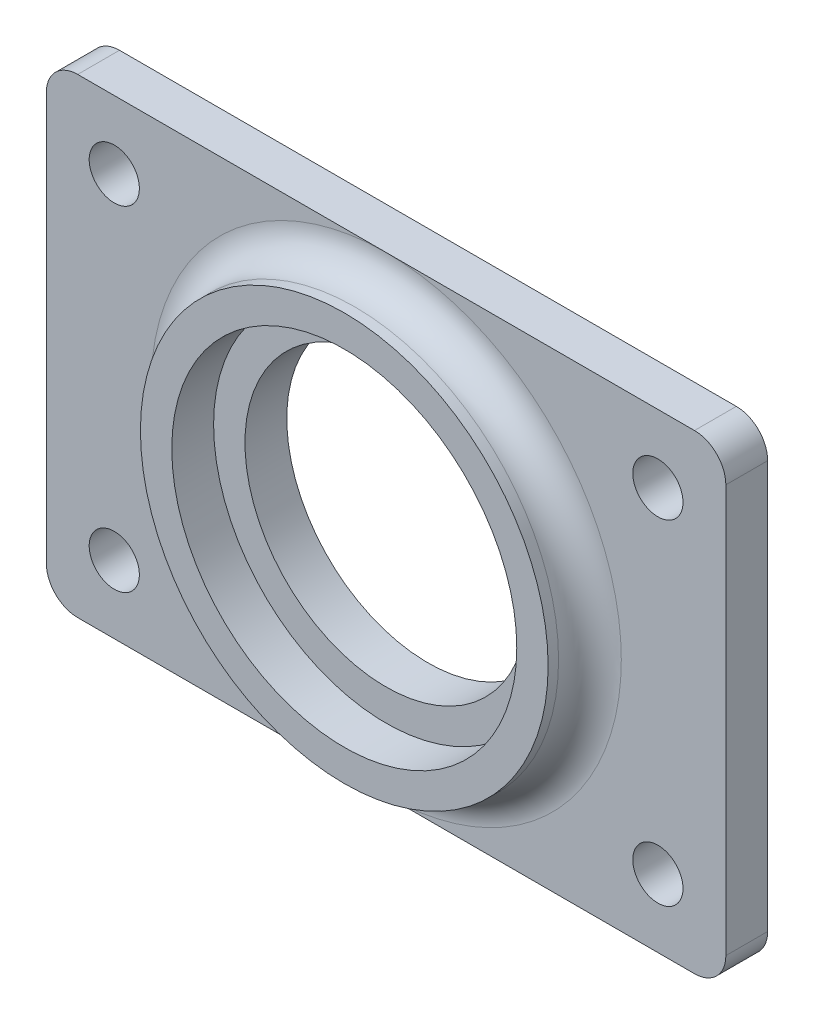
ISO-10303-21;
HEADER;
FILE_DESCRIPTION(('STEP AP214'),'2;1');
FILE_NAME('part.step','',(''),(''),'','','');
FILE_SCHEMA(('AUTOMOTIVE_DESIGN { 1 0 10303 214 1 1 1 1 }'));
ENDSEC;
DATA;
#1=APPLICATION_CONTEXT('core data for automotive mechanical design processes');
#2=APPLICATION_PROTOCOL_DEFINITION('international standard','automotive_design',2000,#1);
#3=PRODUCT_CONTEXT('',#1,'mechanical');
#4=PRODUCT('Part','Part','',(#3));
#5=PRODUCT_RELATED_PRODUCT_CATEGORY('part','',(#4));
#6=PRODUCT_DEFINITION_FORMATION('','',#4);
#7=PRODUCT_DEFINITION_CONTEXT('part definition',#1,'design');
#8=PRODUCT_DEFINITION('design','',#6,#7);
#9=PRODUCT_DEFINITION_SHAPE('','',#8);
#10=(LENGTH_UNIT() NAMED_UNIT(*) SI_UNIT(.MILLI.,.METRE.));
#11=(NAMED_UNIT(*) PLANE_ANGLE_UNIT() SI_UNIT($,.RADIAN.));
#12=(NAMED_UNIT(*) SI_UNIT($,.STERADIAN.) SOLID_ANGLE_UNIT());
#13=UNCERTAINTY_MEASURE_WITH_UNIT(LENGTH_MEASURE(1.E-05),#10,'distance_accuracy_value','');
#14=(GEOMETRIC_REPRESENTATION_CONTEXT(3) GLOBAL_UNCERTAINTY_ASSIGNED_CONTEXT((#13)) GLOBAL_UNIT_ASSIGNED_CONTEXT((#10,
#11,#12)) REPRESENTATION_CONTEXT('',''));
#15=CARTESIAN_POINT('',(0.,0.,0.));
#16=DIRECTION('',(0.,0.,1.));
#17=DIRECTION('',(1.,0.,0.));
#18=AXIS2_PLACEMENT_3D('',#15,#16,#17);
#19=CARTESIAN_POINT('',(0.,0.,4.));
#20=DIRECTION('',(0.,0.,1.));
#21=DIRECTION('',(1.,0.,0.));
#22=AXIS2_PLACEMENT_3D('',#19,#20,#21);
#23=PLANE('',#22);
#24=CARTESIAN_POINT('',(-26.,16.,4.));
#25=DIRECTION('',(0.,0.,1.));
#26=DIRECTION('',(1.,0.,0.));
#27=AXIS2_PLACEMENT_3D('',#24,#25,#26);
#28=CIRCLE('',#27,2.4);
#29=CARTESIAN_POINT('',(-23.6,16.,4.));
#30=VERTEX_POINT('',#29);
#31=EDGE_CURVE('E220',#30,#30,#28,.T.);
#32=ORIENTED_EDGE('',*,*,#31,.F.);
#33=EDGE_LOOP('',(#32));
#34=FACE_BOUND('',#33,.T.);
#35=CARTESIAN_POINT('',(-26.,-16.,4.));
#36=DIRECTION('',(0.,0.,1.));
#37=DIRECTION('',(1.,0.,0.));
#38=AXIS2_PLACEMENT_3D('',#35,#36,#37);
#39=CIRCLE('',#38,2.4);
#40=CARTESIAN_POINT('',(-23.6,-16.,4.));
#41=VERTEX_POINT('',#40);
#42=EDGE_CURVE('E226',#41,#41,#39,.T.);
#43=ORIENTED_EDGE('',*,*,#42,.F.);
#44=EDGE_LOOP('',(#43));
#45=FACE_BOUND('',#44,.T.);
#46=DIRECTION('',(0.,-1.,0.));
#47=VECTOR('',#46,1.);
#48=CARTESIAN_POINT('',(-32.5,0.,4.));
#49=LINE('',#48,#47);
#50=CARTESIAN_POINT('',(-32.5,19.5,4.));
#51=VERTEX_POINT('',#50);
#52=CARTESIAN_POINT('',(-32.5,-19.5,4.));
#53=VERTEX_POINT('',#52);
#54=EDGE_CURVE('E201',#51,#53,#49,.T.);
#55=ORIENTED_EDGE('',*,*,#54,.T.);
#56=CARTESIAN_POINT('',(-29.5,-19.5,4.));
#57=DIRECTION('',(0.,0.,1.));
#58=DIRECTION('',(1.,0.,0.));
#59=AXIS2_PLACEMENT_3D('',#56,#57,#58);
#60=CIRCLE('',#59,3.);
#61=CARTESIAN_POINT('',(-29.5,-22.5,4.));
#62=VERTEX_POINT('',#61);
#63=EDGE_CURVE('E170',#53,#62,#60,.T.);
#64=ORIENTED_EDGE('',*,*,#63,.T.);
#65=DIRECTION('',(1.,0.,0.));
#66=VECTOR('',#65,1.);
#67=CARTESIAN_POINT('',(0.,-22.5,4.));
#68=LINE('',#67,#66);
#69=CARTESIAN_POINT('',(0.,-22.5,4.));
#70=VERTEX_POINT('',#69);
#71=EDGE_CURVE('E135',#62,#70,#68,.T.);
#72=ORIENTED_EDGE('',*,*,#71,.T.);
#73=CARTESIAN_POINT('',(0.,0.,4.));
#74=DIRECTION('',(0.,0.,1.));
#75=DIRECTION('',(1.,0.,0.));
#76=AXIS2_PLACEMENT_3D('',#73,#74,#75);
#77=CIRCLE('',#76,22.5);
#78=CARTESIAN_POINT('',(0.,22.5,4.));
#79=VERTEX_POINT('',#78);
#80=EDGE_CURVE('E166',#70,#79,#77,.F.);
#81=ORIENTED_EDGE('',*,*,#80,.T.);
#82=DIRECTION('',(1.,0.,0.));
#83=VECTOR('',#82,1.);
#84=CARTESIAN_POINT('',(0.,22.5,4.));
#85=LINE('',#84,#83);
#86=CARTESIAN_POINT('',(-29.5,22.5,4.));
#87=VERTEX_POINT('',#86);
#88=EDGE_CURVE('E204',#87,#79,#85,.T.);
#89=ORIENTED_EDGE('',*,*,#88,.F.);
#90=CARTESIAN_POINT('',(-29.5,19.5,4.));
#91=DIRECTION('',(0.,0.,1.));
#92=DIRECTION('',(1.,0.,0.));
#93=AXIS2_PLACEMENT_3D('',#90,#91,#92);
#94=CIRCLE('',#93,3.);
#95=EDGE_CURVE('E168',#87,#51,#94,.T.);
#96=ORIENTED_EDGE('',*,*,#95,.T.);
#97=EDGE_LOOP('',(#55,#64,#72,#81,#89,#96));
#98=FACE_BOUND('',#97,.T.);
#99=ADVANCED_FACE('F41',(#34,#45,#98),#23,.T.);
#100=CARTESIAN_POINT('',(32.5,0.,4.));
#101=DIRECTION('',(1.,0.,0.));
#102=DIRECTION('',(0.,0.,-1.));
#103=AXIS2_PLACEMENT_3D('',#100,#101,#102);
#104=PLANE('',#103);
#105=DIRECTION('',(0.,-1.,0.));
#106=VECTOR('',#105,1.);
#107=CARTESIAN_POINT('',(32.5,0.,4.));
#108=LINE('',#107,#106);
#109=CARTESIAN_POINT('',(32.5,19.5,4.));
#110=VERTEX_POINT('',#109);
#111=CARTESIAN_POINT('',(32.5,-19.5,4.));
#112=VERTEX_POINT('',#111);
#113=EDGE_CURVE('E142',#110,#112,#108,.T.);
#114=ORIENTED_EDGE('',*,*,#113,.T.);
#115=DIRECTION('',(0.,0.,-1.));
#116=VECTOR('',#115,1.);
#117=CARTESIAN_POINT('',(32.5,-19.5,0.));
#118=LINE('',#117,#116);
#119=CARTESIAN_POINT('',(32.5,-19.5,0.));
#120=VERTEX_POINT('',#119);
#121=EDGE_CURVE('E11',#112,#120,#118,.T.);
#122=ORIENTED_EDGE('',*,*,#121,.T.);
#123=DIRECTION('',(0.,-1.,0.));
#124=VECTOR('',#123,1.);
#125=CARTESIAN_POINT('',(32.5,0.,0.));
#126=LINE('',#125,#124);
#127=CARTESIAN_POINT('',(32.5,19.5,0.));
#128=VERTEX_POINT('',#127);
#129=EDGE_CURVE('E184',#128,#120,#126,.T.);
#130=ORIENTED_EDGE('',*,*,#129,.F.);
#131=DIRECTION('',(0.,0.,-1.));
#132=VECTOR('',#131,1.);
#133=CARTESIAN_POINT('',(32.5,19.5,4.));
#134=LINE('',#133,#132);
#135=EDGE_CURVE('E49',#128,#110,#134,.F.);
#136=ORIENTED_EDGE('',*,*,#135,.T.);
#137=EDGE_LOOP('',(#114,#122,#130,#136));
#138=FACE_BOUND('',#137,.T.);
#139=ADVANCED_FACE('F182',(#138),#104,.T.);
#140=CARTESIAN_POINT('',(0.,22.5,4.));
#141=DIRECTION('',(0.,1.,0.));
#142=DIRECTION('',(0.,0.,1.));
#143=AXIS2_PLACEMENT_3D('',#140,#141,#142);
#144=PLANE('',#143);
#145=DIRECTION('',(1.,0.,0.));
#146=VECTOR('',#145,1.);
#147=CARTESIAN_POINT('',(0.,22.5,0.));
#148=LINE('',#147,#146);
#149=CARTESIAN_POINT('',(-29.5,22.5,0.));
#150=VERTEX_POINT('',#149);
#151=CARTESIAN_POINT('',(29.5,22.5,0.));
#152=VERTEX_POINT('',#151);
#153=EDGE_CURVE('E148',#150,#152,#148,.T.);
#154=ORIENTED_EDGE('',*,*,#153,.F.);
#155=DIRECTION('',(0.,0.,-1.));
#156=VECTOR('',#155,1.);
#157=CARTESIAN_POINT('',(-29.5,22.5,4.));
#158=LINE('',#157,#156);
#159=EDGE_CURVE('E175',#150,#87,#158,.F.);
#160=ORIENTED_EDGE('',*,*,#159,.T.);
#161=ORIENTED_EDGE('',*,*,#88,.T.);
#162=CARTESIAN_POINT('',(29.5,22.5,4.));
#163=VERTEX_POINT('',#162);
#164=EDGE_CURVE('E146',#79,#163,#85,.T.);
#165=ORIENTED_EDGE('',*,*,#164,.T.);
#166=DIRECTION('',(0.,0.,-1.));
#167=VECTOR('',#166,1.);
#168=CARTESIAN_POINT('',(29.5,22.5,4.));
#169=LINE('',#168,#167);
#170=EDGE_CURVE('E172',#163,#152,#169,.T.);
#171=ORIENTED_EDGE('',*,*,#170,.T.);
#172=EDGE_LOOP('',(#154,#160,#161,#165,#171));
#173=FACE_BOUND('',#172,.T.);
#174=ADVANCED_FACE('F193',(#173),#144,.T.);
#175=CARTESIAN_POINT('',(-32.5,0.,4.));
#176=DIRECTION('',(1.,0.,0.));
#177=DIRECTION('',(0.,1.,0.));
#178=AXIS2_PLACEMENT_3D('',#175,#176,#177);
#179=PLANE('',#178);
#180=DIRECTION('',(0.,-1.,0.));
#181=VECTOR('',#180,1.);
#182=CARTESIAN_POINT('',(-32.5,0.,0.));
#183=LINE('',#182,#181);
#184=CARTESIAN_POINT('',(-32.5,19.5,0.));
#185=VERTEX_POINT('',#184);
#186=CARTESIAN_POINT('',(-32.5,-19.5,0.));
#187=VERTEX_POINT('',#186);
#188=EDGE_CURVE('E143',#185,#187,#183,.T.);
#189=ORIENTED_EDGE('',*,*,#188,.T.);
#190=DIRECTION('',(0.,0.,-1.));
#191=VECTOR('',#190,1.);
#192=CARTESIAN_POINT('',(-32.5,-19.5,4.));
#193=LINE('',#192,#191);
#194=EDGE_CURVE('E119',#187,#53,#193,.F.);
#195=ORIENTED_EDGE('',*,*,#194,.T.);
#196=ORIENTED_EDGE('',*,*,#54,.F.);
#197=DIRECTION('',(0.,0.,-1.));
#198=VECTOR('',#197,1.);
#199=CARTESIAN_POINT('',(-32.5,19.5,0.));
#200=LINE('',#199,#198);
#201=EDGE_CURVE('E124',#51,#185,#200,.T.);
#202=ORIENTED_EDGE('',*,*,#201,.T.);
#203=EDGE_LOOP('',(#189,#195,#196,#202));
#204=FACE_BOUND('',#203,.T.);
#205=ADVANCED_FACE('F316',(#204),#179,.F.);
#206=CARTESIAN_POINT('',(0.,-22.5,4.));
#207=DIRECTION('',(0.,1.,0.));
#208=DIRECTION('',(0.,0.,1.));
#209=AXIS2_PLACEMENT_3D('',#206,#207,#208);
#210=PLANE('',#209);
#211=ORIENTED_EDGE('',*,*,#71,.F.);
#212=DIRECTION('',(0.,0.,-1.));
#213=VECTOR('',#212,1.);
#214=CARTESIAN_POINT('',(-29.5,-22.5,4.));
#215=LINE('',#214,#213);
#216=CARTESIAN_POINT('',(-29.5,-22.5,0.));
#217=VERTEX_POINT('',#216);
#218=EDGE_CURVE('E118',#62,#217,#215,.T.);
#219=ORIENTED_EDGE('',*,*,#218,.T.);
#220=DIRECTION('',(1.,0.,0.));
#221=VECTOR('',#220,1.);
#222=CARTESIAN_POINT('',(0.,-22.5,0.));
#223=LINE('',#222,#221);
#224=CARTESIAN_POINT('',(29.5,-22.5,0.));
#225=VERTEX_POINT('',#224);
#226=EDGE_CURVE('E131',#217,#225,#223,.T.);
#227=ORIENTED_EDGE('',*,*,#226,.T.);
#228=DIRECTION('',(0.,0.,-1.));
#229=VECTOR('',#228,1.);
#230=CARTESIAN_POINT('',(29.5,-22.5,4.));
#231=LINE('',#230,#229);
#232=CARTESIAN_POINT('',(29.5,-22.5,4.));
#233=VERTEX_POINT('',#232);
#234=EDGE_CURVE('E137',#225,#233,#231,.F.);
#235=ORIENTED_EDGE('',*,*,#234,.T.);
#236=EDGE_CURVE('E199',#70,#233,#68,.T.);
#237=ORIENTED_EDGE('',*,*,#236,.F.);
#238=EDGE_LOOP('',(#211,#219,#227,#235,#237));
#239=FACE_BOUND('',#238,.T.);
#240=ADVANCED_FACE('F130',(#239),#210,.F.);
#241=CARTESIAN_POINT('',(26.,16.,4.));
#242=DIRECTION('',(0.,0.,1.));
#243=DIRECTION('',(1.,0.,0.));
#244=AXIS2_PLACEMENT_3D('',#241,#242,#243);
#245=CIRCLE('',#244,2.4);
#246=CARTESIAN_POINT('',(28.4,16.,4.));
#247=VERTEX_POINT('',#246);
#248=EDGE_CURVE('E238',#247,#247,#245,.T.);
#249=ORIENTED_EDGE('',*,*,#248,.F.);
#250=EDGE_LOOP('',(#249));
#251=FACE_BOUND('',#250,.T.);
#252=CARTESIAN_POINT('',(26.,-16.,4.));
#253=DIRECTION('',(0.,0.,1.));
#254=DIRECTION('',(1.,0.,0.));
#255=AXIS2_PLACEMENT_3D('',#252,#253,#254);
#256=CIRCLE('',#255,2.4);
#257=CARTESIAN_POINT('',(28.4,-16.,4.));
#258=VERTEX_POINT('',#257);
#259=EDGE_CURVE('E232',#258,#258,#256,.T.);
#260=ORIENTED_EDGE('',*,*,#259,.F.);
#261=EDGE_LOOP('',(#260));
#262=FACE_BOUND('',#261,.T.);
#263=ORIENTED_EDGE('',*,*,#164,.F.);
#264=CARTESIAN_POINT('',(0.,0.,4.));
#265=DIRECTION('',(0.,0.,1.));
#266=DIRECTION('',(1.,0.,0.));
#267=AXIS2_PLACEMENT_3D('',#264,#265,#266);
#268=CIRCLE('',#267,22.5);
#269=EDGE_CURVE('E63',#79,#70,#268,.F.);
#270=ORIENTED_EDGE('',*,*,#269,.T.);
#271=ORIENTED_EDGE('',*,*,#236,.T.);
#272=CARTESIAN_POINT('',(29.5,-19.5,4.));
#273=DIRECTION('',(0.,0.,1.));
#274=DIRECTION('',(1.,0.,0.));
#275=AXIS2_PLACEMENT_3D('',#272,#273,#274);
#276=CIRCLE('',#275,3.);
#277=EDGE_CURVE('E163',#233,#112,#276,.T.);
#278=ORIENTED_EDGE('',*,*,#277,.T.);
#279=ORIENTED_EDGE('',*,*,#113,.F.);
#280=CARTESIAN_POINT('',(29.5,19.5,4.));
#281=DIRECTION('',(0.,0.,1.));
#282=DIRECTION('',(1.,0.,0.));
#283=AXIS2_PLACEMENT_3D('',#280,#281,#282);
#284=CIRCLE('',#283,3.);
#285=EDGE_CURVE('E56',#110,#163,#284,.T.);
#286=ORIENTED_EDGE('',*,*,#285,.T.);
#287=EDGE_LOOP('',(#263,#270,#271,#278,#279,#286));
#288=FACE_BOUND('',#287,.T.);
#289=ADVANCED_FACE('F186',(#251,#262,#288),#23,.T.);
#290=CARTESIAN_POINT('',(0.,0.,0.));
#291=DIRECTION('',(0.,0.,1.));
#292=DIRECTION('',(1.,0.,0.));
#293=AXIS2_PLACEMENT_3D('',#290,#291,#292);
#294=PLANE('',#293);
#295=CARTESIAN_POINT('',(26.,16.,0.));
#296=DIRECTION('',(0.,0.,1.));
#297=DIRECTION('',(1.,0.,0.));
#298=AXIS2_PLACEMENT_3D('',#295,#296,#297);
#299=CIRCLE('',#298,2.4);
#300=CARTESIAN_POINT('',(28.4,16.,0.));
#301=VERTEX_POINT('',#300);
#302=EDGE_CURVE('E235',#301,#301,#299,.T.);
#303=ORIENTED_EDGE('',*,*,#302,.T.);
#304=EDGE_LOOP('',(#303));
#305=FACE_BOUND('',#304,.T.);
#306=CARTESIAN_POINT('',(26.,-16.,0.));
#307=DIRECTION('',(0.,0.,1.));
#308=DIRECTION('',(1.,0.,0.));
#309=AXIS2_PLACEMENT_3D('',#306,#307,#308);
#310=CIRCLE('',#309,2.4);
#311=CARTESIAN_POINT('',(28.4,-16.,0.));
#312=VERTEX_POINT('',#311);
#313=EDGE_CURVE('E229',#312,#312,#310,.T.);
#314=ORIENTED_EDGE('',*,*,#313,.T.);
#315=EDGE_LOOP('',(#314));
#316=FACE_BOUND('',#315,.T.);
#317=CARTESIAN_POINT('',(-26.,-16.,0.));
#318=DIRECTION('',(0.,0.,1.));
#319=DIRECTION('',(1.,0.,0.));
#320=AXIS2_PLACEMENT_3D('',#317,#318,#319);
#321=CIRCLE('',#320,2.4);
#322=CARTESIAN_POINT('',(-23.6,-16.,0.));
#323=VERTEX_POINT('',#322);
#324=EDGE_CURVE('E223',#323,#323,#321,.T.);
#325=ORIENTED_EDGE('',*,*,#324,.T.);
#326=EDGE_LOOP('',(#325));
#327=FACE_BOUND('',#326,.T.);
#328=CARTESIAN_POINT('',(-26.,16.,0.));
#329=DIRECTION('',(0.,0.,1.));
#330=DIRECTION('',(1.,0.,0.));
#331=AXIS2_PLACEMENT_3D('',#328,#329,#330);
#332=CIRCLE('',#331,2.4);
#333=CARTESIAN_POINT('',(-23.6,16.,0.));
#334=VERTEX_POINT('',#333);
#335=EDGE_CURVE('E215',#334,#334,#332,.T.);
#336=ORIENTED_EDGE('',*,*,#335,.T.);
#337=EDGE_LOOP('',(#336));
#338=FACE_BOUND('',#337,.T.);
#339=CARTESIAN_POINT('',(0.,0.,0.));
#340=DIRECTION('',(0.,0.,1.));
#341=DIRECTION('',(1.,0.,0.));
#342=AXIS2_PLACEMENT_3D('',#339,#340,#341);
#343=CIRCLE('',#342,13.5);
#344=CARTESIAN_POINT('',(13.5,0.,0.));
#345=VERTEX_POINT('',#344);
#346=EDGE_CURVE('E211',#345,#345,#343,.T.);
#347=ORIENTED_EDGE('',*,*,#346,.T.);
#348=EDGE_LOOP('',(#347));
#349=FACE_BOUND('',#348,.T.);
#350=ORIENTED_EDGE('',*,*,#226,.F.);
#351=CARTESIAN_POINT('',(-29.5,-19.5,0.));
#352=DIRECTION('',(0.,0.,1.));
#353=DIRECTION('',(1.,0.,0.));
#354=AXIS2_PLACEMENT_3D('',#351,#352,#353);
#355=CIRCLE('',#354,3.);
#356=EDGE_CURVE('E114',#217,#187,#355,.F.);
#357=ORIENTED_EDGE('',*,*,#356,.T.);
#358=ORIENTED_EDGE('',*,*,#188,.F.);
#359=CARTESIAN_POINT('',(-29.5,19.5,0.));
#360=DIRECTION('',(0.,0.,1.));
#361=DIRECTION('',(1.,0.,0.));
#362=AXIS2_PLACEMENT_3D('',#359,#360,#361);
#363=CIRCLE('',#362,3.);
#364=EDGE_CURVE('E125',#185,#150,#363,.F.);
#365=ORIENTED_EDGE('',*,*,#364,.T.);
#366=ORIENTED_EDGE('',*,*,#153,.T.);
#367=CARTESIAN_POINT('',(29.5,19.5,0.));
#368=DIRECTION('',(0.,0.,1.));
#369=DIRECTION('',(1.,0.,0.));
#370=AXIS2_PLACEMENT_3D('',#367,#368,#369);
#371=CIRCLE('',#370,3.);
#372=EDGE_CURVE('E136',#152,#128,#371,.F.);
#373=ORIENTED_EDGE('',*,*,#372,.T.);
#374=ORIENTED_EDGE('',*,*,#129,.T.);
#375=CARTESIAN_POINT('',(29.5,-19.5,0.));
#376=DIRECTION('',(0.,0.,1.));
#377=DIRECTION('',(1.,0.,0.));
#378=AXIS2_PLACEMENT_3D('',#375,#376,#377);
#379=CIRCLE('',#378,3.);
#380=EDGE_CURVE('E141',#120,#225,#379,.F.);
#381=ORIENTED_EDGE('',*,*,#380,.T.);
#382=EDGE_LOOP('',(#350,#357,#358,#365,#366,#373,#374,#381));
#383=FACE_BOUND('',#382,.T.);
#384=ADVANCED_FACE('F139',(#305,#316,#327,#338,#349,#383),#294,.F.);
#385=CARTESIAN_POINT('',(0.,0.,8.));
#386=DIRECTION('',(0.,0.,1.));
#387=DIRECTION('',(1.,0.,0.));
#388=AXIS2_PLACEMENT_3D('',#385,#386,#387);
#389=PLANE('',#388);
#390=CARTESIAN_POINT('',(0.,0.,8.));
#391=DIRECTION('',(0.,0.,1.));
#392=DIRECTION('',(1.,0.,0.));
#393=AXIS2_PLACEMENT_3D('',#390,#391,#392);
#394=CIRCLE('',#393,19.5);
#395=CARTESIAN_POINT('',(19.5,0.,8.));
#396=VERTEX_POINT('',#395);
#397=EDGE_CURVE('E196',#396,#396,#394,.T.);
#398=ORIENTED_EDGE('',*,*,#397,.T.);
#399=EDGE_LOOP('',(#398));
#400=FACE_BOUND('',#399,.T.);
#401=CARTESIAN_POINT('',(0.,0.,8.));
#402=DIRECTION('',(0.,0.,1.));
#403=DIRECTION('',(1.,0.,0.));
#404=AXIS2_PLACEMENT_3D('',#401,#402,#403);
#405=CIRCLE('',#404,16.5);
#406=CARTESIAN_POINT('',(16.5,0.,8.));
#407=VERTEX_POINT('',#406);
#408=EDGE_CURVE('E208',#407,#407,#405,.T.);
#409=ORIENTED_EDGE('',*,*,#408,.F.);
#410=EDGE_LOOP('',(#409));
#411=FACE_BOUND('',#410,.T.);
#412=ADVANCED_FACE('F297',(#400,#411),#389,.T.);
#413=CARTESIAN_POINT('',(0.,0.,8.));
#414=DIRECTION('',(0.,0.,-1.));
#415=DIRECTION('',(-1.,0.,0.));
#416=AXIS2_PLACEMENT_3D('',#413,#414,#415);
#417=CYLINDRICAL_SURFACE('',#416,19.5);
#418=CARTESIAN_POINT('',(0.,0.,7.));
#419=DIRECTION('',(0.,0.,1.));
#420=DIRECTION('',(1.,0.,0.));
#421=AXIS2_PLACEMENT_3D('',#418,#419,#420);
#422=CIRCLE('',#421,19.5);
#423=CARTESIAN_POINT('',(19.5,0.,7.));
#424=VERTEX_POINT('',#423);
#425=EDGE_CURVE('E177',#424,#424,#422,.T.);
#426=ORIENTED_EDGE('',*,*,#425,.T.);
#427=EDGE_LOOP('',(#426));
#428=FACE_BOUND('',#427,.T.);
#429=ORIENTED_EDGE('',*,*,#397,.F.);
#430=EDGE_LOOP('',(#429));
#431=FACE_BOUND('',#430,.T.);
#432=ADVANCED_FACE('F285',(#428,#431),#417,.T.);
#433=CARTESIAN_POINT('',(0.,0.,8.));
#434=DIRECTION('',(0.,0.,-1.));
#435=DIRECTION('',(-1.,0.,0.));
#436=AXIS2_PLACEMENT_3D('',#433,#434,#435);
#437=CYLINDRICAL_SURFACE('',#436,16.5);
#438=ORIENTED_EDGE('',*,*,#408,.T.);
#439=EDGE_LOOP('',(#438));
#440=FACE_BOUND('',#439,.T.);
#441=CARTESIAN_POINT('',(0.,0.,4.));
#442=DIRECTION('',(0.,0.,1.));
#443=DIRECTION('',(1.,0.,0.));
#444=AXIS2_PLACEMENT_3D('',#441,#442,#443);
#445=CIRCLE('',#444,16.5);
#446=CARTESIAN_POINT('',(16.5,0.,4.));
#447=VERTEX_POINT('',#446);
#448=EDGE_CURVE('E152',#447,#447,#445,.F.);
#449=ORIENTED_EDGE('',*,*,#448,.T.);
#450=EDGE_LOOP('',(#449));
#451=FACE_BOUND('',#450,.T.);
#452=ADVANCED_FACE('F277',(#440,#451),#437,.F.);
#453=CARTESIAN_POINT('',(0.,0.,4.));
#454=DIRECTION('',(0.,0.,1.));
#455=DIRECTION('',(1.,0.,0.));
#456=AXIS2_PLACEMENT_3D('',#453,#454,#455);
#457=CIRCLE('',#456,13.5);
#458=CARTESIAN_POINT('',(13.5,0.,4.));
#459=VERTEX_POINT('',#458);
#460=EDGE_CURVE('E212',#459,#459,#457,.T.);
#461=ORIENTED_EDGE('',*,*,#460,.F.);
#462=EDGE_LOOP('',(#461));
#463=FACE_BOUND('',#462,.T.);
#464=ORIENTED_EDGE('',*,*,#448,.F.);
#465=EDGE_LOOP('',(#464));
#466=FACE_BOUND('',#465,.T.);
#467=ADVANCED_FACE('F247',(#463,#466),#23,.T.);
#468=CARTESIAN_POINT('',(0.,0.,0.));
#469=DIRECTION('',(0.,0.,1.));
#470=DIRECTION('',(1.,0.,0.));
#471=AXIS2_PLACEMENT_3D('',#468,#469,#470);
#472=CYLINDRICAL_SURFACE('',#471,13.5);
#473=ORIENTED_EDGE('',*,*,#346,.F.);
#474=EDGE_LOOP('',(#473));
#475=FACE_BOUND('',#474,.T.);
#476=ORIENTED_EDGE('',*,*,#460,.T.);
#477=EDGE_LOOP('',(#476));
#478=FACE_BOUND('',#477,.T.);
#479=ADVANCED_FACE('F276',(#475,#478),#472,.F.);
#480=CARTESIAN_POINT('',(-26.,16.,4.));
#481=DIRECTION('',(0.,0.,1.));
#482=DIRECTION('',(1.,0.,0.));
#483=AXIS2_PLACEMENT_3D('',#480,#481,#482);
#484=CYLINDRICAL_SURFACE('',#483,2.4);
#485=ORIENTED_EDGE('',*,*,#335,.F.);
#486=EDGE_LOOP('',(#485));
#487=FACE_BOUND('',#486,.T.);
#488=ORIENTED_EDGE('',*,*,#31,.T.);
#489=EDGE_LOOP('',(#488));
#490=FACE_BOUND('',#489,.T.);
#491=ADVANCED_FACE('F261',(#487,#490),#484,.F.);
#492=CARTESIAN_POINT('',(-26.,-16.,4.));
#493=DIRECTION('',(0.,0.,1.));
#494=DIRECTION('',(1.,0.,0.));
#495=AXIS2_PLACEMENT_3D('',#492,#493,#494);
#496=CYLINDRICAL_SURFACE('',#495,2.4);
#497=ORIENTED_EDGE('',*,*,#324,.F.);
#498=EDGE_LOOP('',(#497));
#499=FACE_BOUND('',#498,.T.);
#500=ORIENTED_EDGE('',*,*,#42,.T.);
#501=EDGE_LOOP('',(#500));
#502=FACE_BOUND('',#501,.T.);
#503=ADVANCED_FACE('F252',(#499,#502),#496,.F.);
#504=CARTESIAN_POINT('',(26.,-16.,4.));
#505=DIRECTION('',(0.,0.,1.));
#506=DIRECTION('',(1.,0.,0.));
#507=AXIS2_PLACEMENT_3D('',#504,#505,#506);
#508=CYLINDRICAL_SURFACE('',#507,2.4);
#509=ORIENTED_EDGE('',*,*,#313,.F.);
#510=EDGE_LOOP('',(#509));
#511=FACE_BOUND('',#510,.T.);
#512=ORIENTED_EDGE('',*,*,#259,.T.);
#513=EDGE_LOOP('',(#512));
#514=FACE_BOUND('',#513,.T.);
#515=ADVANCED_FACE('F250',(#511,#514),#508,.F.);
#516=CARTESIAN_POINT('',(26.,16.,4.));
#517=DIRECTION('',(0.,0.,1.));
#518=DIRECTION('',(1.,0.,0.));
#519=AXIS2_PLACEMENT_3D('',#516,#517,#518);
#520=CYLINDRICAL_SURFACE('',#519,2.4);
#521=ORIENTED_EDGE('',*,*,#302,.F.);
#522=EDGE_LOOP('',(#521));
#523=FACE_BOUND('',#522,.T.);
#524=ORIENTED_EDGE('',*,*,#248,.T.);
#525=EDGE_LOOP('',(#524));
#526=FACE_BOUND('',#525,.T.);
#527=ADVANCED_FACE('F242',(#523,#526),#520,.F.);
#528=CARTESIAN_POINT('',(-29.5,-19.5,4.));
#529=DIRECTION('',(0.,0.,-1.));
#530=DIRECTION('',(-1.,0.,0.));
#531=AXIS2_PLACEMENT_3D('',#528,#529,#530);
#532=CYLINDRICAL_SURFACE('',#531,3.);
#533=ORIENTED_EDGE('',*,*,#63,.F.);
#534=ORIENTED_EDGE('',*,*,#194,.F.);
#535=ORIENTED_EDGE('',*,*,#356,.F.);
#536=ORIENTED_EDGE('',*,*,#218,.F.);
#537=EDGE_LOOP('',(#533,#534,#535,#536));
#538=FACE_BOUND('',#537,.T.);
#539=ADVANCED_FACE('F117',(#538),#532,.T.);
#540=CARTESIAN_POINT('',(-29.5,19.5,4.));
#541=DIRECTION('',(0.,0.,1.));
#542=DIRECTION('',(1.,0.,0.));
#543=AXIS2_PLACEMENT_3D('',#540,#541,#542);
#544=CYLINDRICAL_SURFACE('',#543,3.);
#545=ORIENTED_EDGE('',*,*,#95,.F.);
#546=ORIENTED_EDGE('',*,*,#159,.F.);
#547=ORIENTED_EDGE('',*,*,#364,.F.);
#548=ORIENTED_EDGE('',*,*,#201,.F.);
#549=EDGE_LOOP('',(#545,#546,#547,#548));
#550=FACE_BOUND('',#549,.T.);
#551=ADVANCED_FACE('F324',(#550),#544,.T.);
#552=CARTESIAN_POINT('',(0.,0.,7.));
#553=DIRECTION('',(0.,0.,1.));
#554=DIRECTION('',(1.,0.,0.));
#555=AXIS2_PLACEMENT_3D('',#552,#553,#554);
#556=TOROIDAL_SURFACE('',#555,22.5,3.);
#557=ORIENTED_EDGE('',*,*,#269,.F.);
#558=ORIENTED_EDGE('',*,*,#80,.F.);
#559=EDGE_LOOP('',(#557,#558));
#560=FACE_BOUND('',#559,.T.);
#561=ORIENTED_EDGE('',*,*,#425,.F.);
#562=EDGE_LOOP('',(#561));
#563=FACE_BOUND('',#562,.T.);
#564=ADVANCED_FACE('F327',(#560,#563),#556,.F.);
#565=CARTESIAN_POINT('',(29.5,-19.5,4.));
#566=DIRECTION('',(0.,0.,1.));
#567=DIRECTION('',(1.,0.,0.));
#568=AXIS2_PLACEMENT_3D('',#565,#566,#567);
#569=CYLINDRICAL_SURFACE('',#568,3.);
#570=ORIENTED_EDGE('',*,*,#277,.F.);
#571=ORIENTED_EDGE('',*,*,#234,.F.);
#572=ORIENTED_EDGE('',*,*,#380,.F.);
#573=ORIENTED_EDGE('',*,*,#121,.F.);
#574=EDGE_LOOP('',(#570,#571,#572,#573));
#575=FACE_BOUND('',#574,.T.);
#576=ADVANCED_FACE('F330',(#575),#569,.T.);
#577=CARTESIAN_POINT('',(29.5,19.5,4.));
#578=DIRECTION('',(0.,0.,-1.));
#579=DIRECTION('',(-1.,0.,0.));
#580=AXIS2_PLACEMENT_3D('',#577,#578,#579);
#581=CYLINDRICAL_SURFACE('',#580,3.);
#582=ORIENTED_EDGE('',*,*,#285,.F.);
#583=ORIENTED_EDGE('',*,*,#135,.F.);
#584=ORIENTED_EDGE('',*,*,#372,.F.);
#585=ORIENTED_EDGE('',*,*,#170,.F.);
#586=EDGE_LOOP('',(#582,#583,#584,#585));
#587=FACE_BOUND('',#586,.T.);
#588=ADVANCED_FACE('F43',(#587),#581,.T.);
#589=CLOSED_SHELL('',(#99,#139,#174,#205,#240,#289,#384,#412,#432,#452,#467,#479,#491,#503,#515,
#527,#539,#551,#564,#576,#588));
#590=MANIFOLD_SOLID_BREP('B2',#589);
#591=ADVANCED_BREP_SHAPE_REPRESENTATION('',(#18,#590),#14);
#592=SHAPE_DEFINITION_REPRESENTATION(#9,#591);
ENDSEC;
END-ISO-10303-21;
